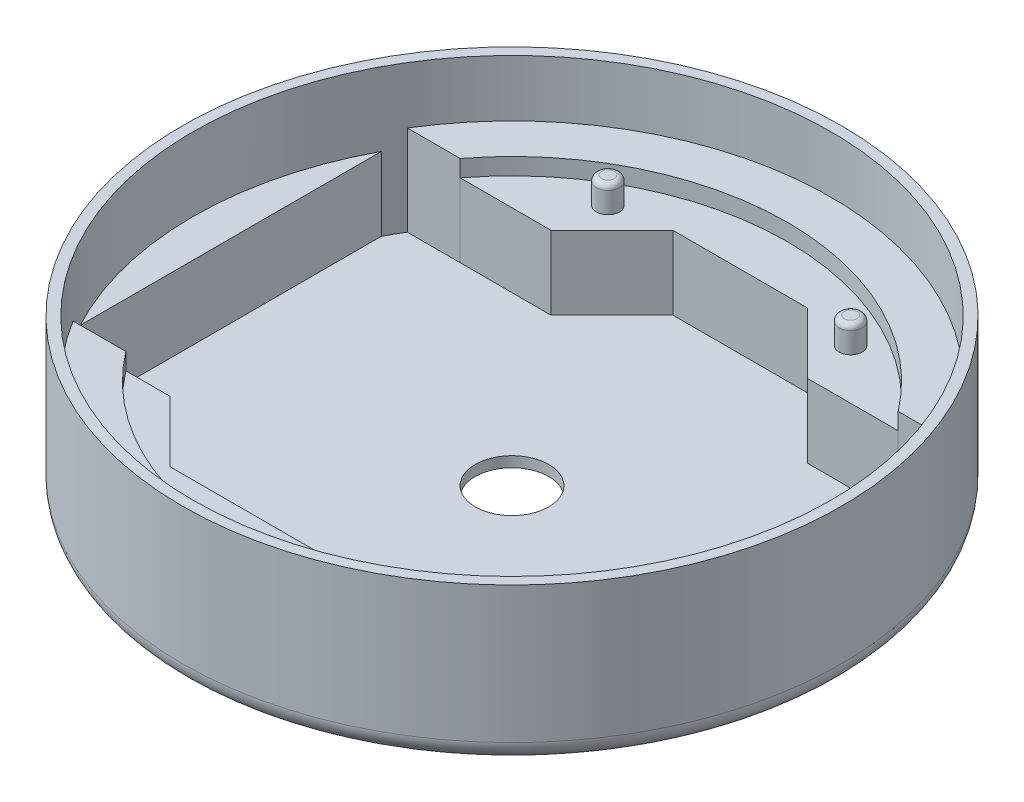
ISO-10303-21;
HEADER;
FILE_DESCRIPTION(('STEP AP214'),'2;1');
FILE_NAME('part.step','',(''),(''),'','','');
FILE_SCHEMA(('AUTOMOTIVE_DESIGN { 1 0 10303 214 1 1 1 1 }'));
ENDSEC;
DATA;
#1=APPLICATION_CONTEXT('core data for automotive mechanical design processes');
#2=APPLICATION_PROTOCOL_DEFINITION('international standard','automotive_design',2000,#1);
#3=PRODUCT_CONTEXT('',#1,'mechanical');
#4=PRODUCT('Part','Part','',(#3));
#5=PRODUCT_RELATED_PRODUCT_CATEGORY('part','',(#4));
#6=PRODUCT_DEFINITION_FORMATION('','',#4);
#7=PRODUCT_DEFINITION_CONTEXT('part definition',#1,'design');
#8=PRODUCT_DEFINITION('design','',#6,#7);
#9=PRODUCT_DEFINITION_SHAPE('','',#8);
#10=(LENGTH_UNIT() NAMED_UNIT(*) SI_UNIT(.MILLI.,.METRE.));
#11=(NAMED_UNIT(*) PLANE_ANGLE_UNIT() SI_UNIT($,.RADIAN.));
#12=(NAMED_UNIT(*) SI_UNIT($,.STERADIAN.) SOLID_ANGLE_UNIT());
#13=UNCERTAINTY_MEASURE_WITH_UNIT(LENGTH_MEASURE(1.E-05),#10,'distance_accuracy_value','');
#14=(GEOMETRIC_REPRESENTATION_CONTEXT(3) GLOBAL_UNCERTAINTY_ASSIGNED_CONTEXT((#13)) GLOBAL_UNIT_ASSIGNED_CONTEXT((#10,
#11,#12)) REPRESENTATION_CONTEXT('',''));
#15=CARTESIAN_POINT('',(0.,0.,0.));
#16=DIRECTION('',(0.,0.,1.));
#17=DIRECTION('',(1.,0.,0.));
#18=AXIS2_PLACEMENT_3D('',#15,#16,#17);
#19=CARTESIAN_POINT('',(25.8950646842212,8.,-15.925));
#20=DIRECTION('',(0.,0.,-1.));
#21=DIRECTION('',(-1.,0.,0.));
#22=AXIS2_PLACEMENT_3D('',#19,#20,#21);
#23=PLANE('',#22);
#24=DIRECTION('',(0.,-1.,0.));
#25=VECTOR('',#24,1.);
#26=CARTESIAN_POINT('',(20.8676034800358,8.,-15.925));
#27=LINE('',#26,#25);
#28=CARTESIAN_POINT('',(20.8676034800358,8.,-15.925));
#29=VERTEX_POINT('',#28);
#30=CARTESIAN_POINT('',(20.8676034800358,1.,-15.925));
#31=VERTEX_POINT('',#30);
#32=EDGE_CURVE('E11',#29,#31,#27,.T.);
#33=ORIENTED_EDGE('',*,*,#32,.F.);
#34=DIRECTION('',(1.,0.,0.));
#35=VECTOR('',#34,1.);
#36=CARTESIAN_POINT('',(25.8950646842212,8.,-15.925));
#37=LINE('',#36,#35);
#38=CARTESIAN_POINT('',(12.2172812531431,8.,-15.925));
#39=VERTEX_POINT('',#38);
#40=EDGE_CURVE('E299',#39,#29,#37,.T.);
#41=ORIENTED_EDGE('',*,*,#40,.F.);
#42=DIRECTION('',(0.,-1.,0.));
#43=VECTOR('',#42,1.);
#44=CARTESIAN_POINT('',(12.2172812531431,8.,-15.925));
#45=LINE('',#44,#43);
#46=CARTESIAN_POINT('',(12.2172812531431,1.,-15.925));
#47=VERTEX_POINT('',#46);
#48=EDGE_CURVE('E318',#39,#47,#45,.T.);
#49=ORIENTED_EDGE('',*,*,#48,.T.);
#50=DIRECTION('',(1.,0.,0.));
#51=VECTOR('',#50,1.);
#52=CARTESIAN_POINT('',(25.8950646842212,1.,-15.925));
#53=LINE('',#52,#51);
#54=EDGE_CURVE('E293',#47,#31,#53,.T.);
#55=ORIENTED_EDGE('',*,*,#54,.T.);
#56=EDGE_LOOP('',(#33,#41,#49,#55));
#57=FACE_BOUND('',#56,.T.);
#58=ADVANCED_FACE('F37',(#57),#23,.F.);
#59=CARTESIAN_POINT('',(-25.8950646842212,8.,-15.925));
#60=DIRECTION('',(0.,0.,-1.));
#61=DIRECTION('',(-1.,0.,0.));
#62=AXIS2_PLACEMENT_3D('',#59,#60,#61);
#63=PLANE('',#62);
#64=DIRECTION('',(0.,-1.,0.));
#65=VECTOR('',#64,1.);
#66=CARTESIAN_POINT('',(-20.8676034800358,8.,-15.925));
#67=LINE('',#66,#65);
#68=CARTESIAN_POINT('',(-20.8676034800358,8.,-15.925));
#69=VERTEX_POINT('',#68);
#70=CARTESIAN_POINT('',(-20.8676034800358,1.,-15.925));
#71=VERTEX_POINT('',#70);
#72=EDGE_CURVE('E46',#69,#71,#67,.T.);
#73=ORIENTED_EDGE('',*,*,#72,.F.);
#74=DIRECTION('',(0.,-1.,0.));
#75=VECTOR('',#74,1.);
#76=CARTESIAN_POINT('',(-20.8676034800358,9.6,-15.925));
#77=LINE('',#76,#75);
#78=CARTESIAN_POINT('',(-20.8676034800358,9.6,-15.925));
#79=VERTEX_POINT('',#78);
#80=EDGE_CURVE('E225',#79,#69,#77,.T.);
#81=ORIENTED_EDGE('',*,*,#80,.F.);
#82=DIRECTION('',(-1.,0.,0.));
#83=VECTOR('',#82,1.);
#84=CARTESIAN_POINT('',(-20.8676034800358,9.6,-15.925));
#85=LINE('',#84,#83);
#86=CARTESIAN_POINT('',(-25.8950646842212,9.6,-15.925));
#87=VERTEX_POINT('',#86);
#88=EDGE_CURVE('E221',#79,#87,#85,.T.);
#89=ORIENTED_EDGE('',*,*,#88,.T.);
#90=DIRECTION('',(0.,-1.,0.));
#91=VECTOR('',#90,1.);
#92=CARTESIAN_POINT('',(-25.8950646842212,8.,-15.925));
#93=LINE('',#92,#91);
#94=CARTESIAN_POINT('',(-25.8950646842212,1.,-15.925));
#95=VERTEX_POINT('',#94);
#96=EDGE_CURVE('E329',#87,#95,#93,.T.);
#97=ORIENTED_EDGE('',*,*,#96,.T.);
#98=DIRECTION('',(1.,0.,0.));
#99=VECTOR('',#98,1.);
#100=CARTESIAN_POINT('',(-25.8950646842212,1.,-15.925));
#101=LINE('',#100,#99);
#102=EDGE_CURVE('E303',#95,#71,#101,.T.);
#103=ORIENTED_EDGE('',*,*,#102,.T.);
#104=EDGE_LOOP('',(#73,#81,#89,#97,#103));
#105=FACE_BOUND('',#104,.T.);
#106=ADVANCED_FACE('F400',(#105),#63,.F.);
#107=CARTESIAN_POINT('',(0.,8.,0.));
#108=DIRECTION('',(0.,-1.,0.));
#109=DIRECTION('',(0.,0.,-1.));
#110=AXIS2_PLACEMENT_3D('',#107,#108,#109);
#111=PLANE('',#110);
#112=CARTESIAN_POINT('',(-11.56,8.,-20.7));
#113=DIRECTION('',(0.,-1.,0.));
#114=DIRECTION('',(0.,0.,-1.));
#115=AXIS2_PLACEMENT_3D('',#112,#113,#114);
#116=CIRCLE('',#115,1.1);
#117=CARTESIAN_POINT('',(-11.56,8.,-21.8));
#118=VERTEX_POINT('',#117);
#119=EDGE_CURVE('E355',#118,#118,#116,.F.);
#120=ORIENTED_EDGE('',*,*,#119,.F.);
#121=EDGE_LOOP('',(#120));
#122=FACE_BOUND('',#121,.T.);
#123=CARTESIAN_POINT('',(0.,8.,0.));
#124=DIRECTION('',(0.,-1.,0.));
#125=DIRECTION('',(0.,0.,-1.));
#126=AXIS2_PLACEMENT_3D('',#123,#124,#125);
#127=CIRCLE('',#126,26.25);
#128=EDGE_CURVE('E205',#69,#29,#127,.T.);
#129=ORIENTED_EDGE('',*,*,#128,.F.);
#130=DIRECTION('',(1.,0.,0.));
#131=VECTOR('',#130,1.);
#132=CARTESIAN_POINT('',(-25.8950646842212,8.,-15.925));
#133=LINE('',#132,#131);
#134=CARTESIAN_POINT('',(-12.2172812531431,8.,-15.925));
#135=VERTEX_POINT('',#134);
#136=EDGE_CURVE('E290',#69,#135,#133,.T.);
#137=ORIENTED_EDGE('',*,*,#136,.T.);
#138=DIRECTION('',(0.707106781186546,0.,-0.707106781186549));
#139=VECTOR('',#138,1.);
#140=CARTESIAN_POINT('',(-12.2172812531431,8.,-15.925));
#141=LINE('',#140,#139);
#142=CARTESIAN_POINT('',(-6.40928125314315,8.,-21.733));
#143=VERTEX_POINT('',#142);
#144=EDGE_CURVE('E292',#135,#143,#141,.T.);
#145=ORIENTED_EDGE('',*,*,#144,.T.);
#146=DIRECTION('',(1.,0.,0.));
#147=VECTOR('',#146,1.);
#148=CARTESIAN_POINT('',(-6.40928125314315,8.,-21.733));
#149=LINE('',#148,#147);
#150=CARTESIAN_POINT('',(6.40928125314315,8.,-21.733));
#151=VERTEX_POINT('',#150);
#152=EDGE_CURVE('E295',#143,#151,#149,.T.);
#153=ORIENTED_EDGE('',*,*,#152,.T.);
#154=DIRECTION('',(0.707106781186547,0.,0.707106781186548));
#155=VECTOR('',#154,1.);
#156=CARTESIAN_POINT('',(12.2172812531431,8.,-15.925));
#157=LINE('',#156,#155);
#158=EDGE_CURVE('E297',#151,#39,#157,.T.);
#159=ORIENTED_EDGE('',*,*,#158,.T.);
#160=ORIENTED_EDGE('',*,*,#40,.T.);
#161=EDGE_LOOP('',(#129,#137,#145,#153,#159,#160));
#162=FACE_BOUND('',#161,.T.);
#163=CARTESIAN_POINT('',(11.56,8.,-20.7));
#164=DIRECTION('',(0.,-1.,0.));
#165=DIRECTION('',(0.,0.,-1.));
#166=AXIS2_PLACEMENT_3D('',#163,#164,#165);
#167=CIRCLE('',#166,1.1);
#168=CARTESIAN_POINT('',(11.56,8.,-21.8));
#169=VERTEX_POINT('',#168);
#170=EDGE_CURVE('E358',#169,#169,#167,.F.);
#171=ORIENTED_EDGE('',*,*,#170,.F.);
#172=EDGE_LOOP('',(#171));
#173=FACE_BOUND('',#172,.T.);
#174=ADVANCED_FACE('F407',(#122,#162,#173),#111,.F.);
#175=CARTESIAN_POINT('',(0.,15.,0.));
#176=DIRECTION('',(0.,-1.,0.));
#177=DIRECTION('',(0.,0.,-1.));
#178=AXIS2_PLACEMENT_3D('',#175,#176,#177);
#179=CYLINDRICAL_SURFACE('',#178,30.4);
#180=CARTESIAN_POINT('',(0.,15.,0.));
#181=DIRECTION('',(0.,1.,0.));
#182=DIRECTION('',(0.,0.,1.));
#183=AXIS2_PLACEMENT_3D('',#180,#181,#182);
#184=CIRCLE('',#183,30.4);
#185=CARTESIAN_POINT('',(0.,15.,30.4));
#186=VERTEX_POINT('',#185);
#187=EDGE_CURVE('E341',#186,#186,#184,.T.);
#188=ORIENTED_EDGE('',*,*,#187,.T.);
#189=EDGE_LOOP('',(#188));
#190=FACE_BOUND('',#189,.T.);
#191=CARTESIAN_POINT('',(0.,9.6,0.));
#192=DIRECTION('',(0.,1.,0.));
#193=DIRECTION('',(0.,0.,1.));
#194=AXIS2_PLACEMENT_3D('',#191,#192,#193);
#195=CIRCLE('',#194,30.4);
#196=CARTESIAN_POINT('',(-25.8950646842212,9.6,15.925));
#197=VERTEX_POINT('',#196);
#198=CARTESIAN_POINT('',(25.8950646842212,9.6,15.925));
#199=VERTEX_POINT('',#198);
#200=EDGE_CURVE('E191',#197,#199,#195,.T.);
#201=ORIENTED_EDGE('',*,*,#200,.F.);
#202=DIRECTION('',(0.,-1.,0.));
#203=VECTOR('',#202,1.);
#204=CARTESIAN_POINT('',(-25.8950646842212,8.,15.925));
#205=LINE('',#204,#203);
#206=CARTESIAN_POINT('',(-25.8950646842212,1.,15.925));
#207=VERTEX_POINT('',#206);
#208=EDGE_CURVE('E187',#197,#207,#205,.T.);
#209=ORIENTED_EDGE('',*,*,#208,.T.);
#210=CARTESIAN_POINT('',(0.,1.,0.));
#211=DIRECTION('',(0.,1.,0.));
#212=DIRECTION('',(0.,0.,1.));
#213=AXIS2_PLACEMENT_3D('',#210,#211,#212);
#214=CIRCLE('',#213,30.4);
#215=CARTESIAN_POINT('',(-26.8,1.,14.3499128917217));
#216=VERTEX_POINT('',#215);
#217=EDGE_CURVE('E342',#216,#207,#214,.T.);
#218=ORIENTED_EDGE('',*,*,#217,.F.);
#219=DIRECTION('',(0.,-1.,0.));
#220=VECTOR('',#219,1.);
#221=CARTESIAN_POINT('',(-26.8,8.,14.3499128917217));
#222=LINE('',#221,#220);
#223=CARTESIAN_POINT('',(-26.8,8.,14.3499128917217));
#224=VERTEX_POINT('',#223);
#225=EDGE_CURVE('E239',#224,#216,#222,.T.);
#226=ORIENTED_EDGE('',*,*,#225,.F.);
#227=CARTESIAN_POINT('',(0.,8.,0.));
#228=DIRECTION('',(0.,1.,0.));
#229=DIRECTION('',(0.,0.,1.));
#230=AXIS2_PLACEMENT_3D('',#227,#228,#229);
#231=CIRCLE('',#230,30.4);
#232=CARTESIAN_POINT('',(-26.8,8.,-14.3499128917217));
#233=VERTEX_POINT('',#232);
#234=EDGE_CURVE('E230',#233,#224,#231,.T.);
#235=ORIENTED_EDGE('',*,*,#234,.F.);
#236=DIRECTION('',(0.,-1.,0.));
#237=VECTOR('',#236,1.);
#238=CARTESIAN_POINT('',(-26.8,8.,-14.3499128917217));
#239=LINE('',#238,#237);
#240=CARTESIAN_POINT('',(-26.8,1.,-14.3499128917217));
#241=VERTEX_POINT('',#240);
#242=EDGE_CURVE('E235',#233,#241,#239,.T.);
#243=ORIENTED_EDGE('',*,*,#242,.T.);
#244=EDGE_CURVE('E338',#95,#241,#214,.T.);
#245=ORIENTED_EDGE('',*,*,#244,.F.);
#246=ORIENTED_EDGE('',*,*,#96,.F.);
#247=CARTESIAN_POINT('',(0.,9.6,0.));
#248=DIRECTION('',(0.,-1.,0.));
#249=DIRECTION('',(0.,0.,-1.));
#250=AXIS2_PLACEMENT_3D('',#247,#248,#249);
#251=CIRCLE('',#250,30.4);
#252=CARTESIAN_POINT('',(25.8950646842212,9.6,-15.925));
#253=VERTEX_POINT('',#252);
#254=EDGE_CURVE('E209',#87,#253,#251,.T.);
#255=ORIENTED_EDGE('',*,*,#254,.T.);
#256=DIRECTION('',(0.,-1.,0.));
#257=VECTOR('',#256,1.);
#258=CARTESIAN_POINT('',(25.8950646842212,8.,-15.925));
#259=LINE('',#258,#257);
#260=CARTESIAN_POINT('',(25.8950646842212,1.,-15.925));
#261=VERTEX_POINT('',#260);
#262=EDGE_CURVE('E302',#253,#261,#259,.T.);
#263=ORIENTED_EDGE('',*,*,#262,.T.);
#264=CARTESIAN_POINT('',(26.8,1.,-14.3499128917216));
#265=VERTEX_POINT('',#264);
#266=EDGE_CURVE('E337',#265,#261,#214,.T.);
#267=ORIENTED_EDGE('',*,*,#266,.F.);
#268=DIRECTION('',(0.,-1.,0.));
#269=VECTOR('',#268,1.);
#270=CARTESIAN_POINT('',(26.8,8.,-14.3499128917217));
#271=LINE('',#270,#269);
#272=CARTESIAN_POINT('',(26.8,8.,-14.3499128917217));
#273=VERTEX_POINT('',#272);
#274=EDGE_CURVE('E251',#273,#265,#271,.T.);
#275=ORIENTED_EDGE('',*,*,#274,.F.);
#276=CARTESIAN_POINT('',(-2.46330733588707E-13,8.,0.));
#277=DIRECTION('',(0.,1.,0.));
#278=DIRECTION('',(0.,0.,1.));
#279=AXIS2_PLACEMENT_3D('',#276,#277,#278);
#280=CIRCLE('',#279,30.4000000000002);
#281=CARTESIAN_POINT('',(26.8,8.,14.3499128917217));
#282=VERTEX_POINT('',#281);
#283=EDGE_CURVE('E242',#282,#273,#280,.T.);
#284=ORIENTED_EDGE('',*,*,#283,.F.);
#285=DIRECTION('',(0.,-1.,0.));
#286=VECTOR('',#285,1.);
#287=CARTESIAN_POINT('',(26.8,8.,14.3499128917217));
#288=LINE('',#287,#286);
#289=CARTESIAN_POINT('',(26.8,1.,14.3499128917217));
#290=VERTEX_POINT('',#289);
#291=EDGE_CURVE('E247',#282,#290,#288,.T.);
#292=ORIENTED_EDGE('',*,*,#291,.T.);
#293=CARTESIAN_POINT('',(25.8950646842212,1.,15.925));
#294=VERTEX_POINT('',#293);
#295=EDGE_CURVE('E343',#294,#290,#214,.T.);
#296=ORIENTED_EDGE('',*,*,#295,.F.);
#297=DIRECTION('',(0.,-1.,0.));
#298=VECTOR('',#297,1.);
#299=CARTESIAN_POINT('',(25.8950646842212,8.,15.925));
#300=LINE('',#299,#298);
#301=EDGE_CURVE('E278',#199,#294,#300,.T.);
#302=ORIENTED_EDGE('',*,*,#301,.F.);
#303=EDGE_LOOP('',(#201,#209,#218,#226,#235,#243,#245,#246,#255,#263,#267,#275,#284,#292,#296,#302));
#304=FACE_BOUND('',#303,.T.);
#305=ADVANCED_FACE('F456',(#190,#304),#179,.F.);
#306=CARTESIAN_POINT('',(0.,8.,0.));
#307=DIRECTION('',(0.,-1.,0.));
#308=DIRECTION('',(0.,0.,-1.));
#309=AXIS2_PLACEMENT_3D('',#306,#307,#308);
#310=PLANE('',#309);
#311=CARTESIAN_POINT('',(0.,8.,0.));
#312=DIRECTION('',(0.,-1.,0.));
#313=DIRECTION('',(0.,0.,1.));
#314=AXIS2_PLACEMENT_3D('',#311,#312,#313);
#315=CIRCLE('',#314,26.25);
#316=CARTESIAN_POINT('',(20.8676034800357,8.,15.925));
#317=VERTEX_POINT('',#316);
#318=CARTESIAN_POINT('',(-20.8676034800357,8.,15.925));
#319=VERTEX_POINT('',#318);
#320=EDGE_CURVE('E201',#317,#319,#315,.T.);
#321=ORIENTED_EDGE('',*,*,#320,.F.);
#322=DIRECTION('',(-1.,0.,0.));
#323=VECTOR('',#322,1.);
#324=CARTESIAN_POINT('',(16.6540006918157,8.,15.925));
#325=LINE('',#324,#323);
#326=CARTESIAN_POINT('',(16.6540006918157,8.,15.925));
#327=VERTEX_POINT('',#326);
#328=EDGE_CURVE('E264',#317,#327,#325,.T.);
#329=ORIENTED_EDGE('',*,*,#328,.T.);
#330=DIRECTION('',(-0.707106781186554,0.,0.707106781186541));
#331=VECTOR('',#330,1.);
#332=CARTESIAN_POINT('',(10.8458,8.,21.7332006918156));
#333=LINE('',#332,#331);
#334=CARTESIAN_POINT('',(10.8458,8.,21.7332006918156));
#335=VERTEX_POINT('',#334);
#336=EDGE_CURVE('E254',#327,#335,#333,.T.);
#337=ORIENTED_EDGE('',*,*,#336,.T.);
#338=DIRECTION('',(-1.,0.,0.));
#339=VECTOR('',#338,1.);
#340=CARTESIAN_POINT('',(-10.8458,8.,21.7332006918156));
#341=LINE('',#340,#339);
#342=CARTESIAN_POINT('',(-10.8458,8.,21.7332006918156));
#343=VERTEX_POINT('',#342);
#344=EDGE_CURVE('E257',#335,#343,#341,.T.);
#345=ORIENTED_EDGE('',*,*,#344,.T.);
#346=DIRECTION('',(-0.707106781186548,0.,-0.707106781186548));
#347=VECTOR('',#346,1.);
#348=CARTESIAN_POINT('',(-10.8458,8.,21.7332006918156));
#349=LINE('',#348,#347);
#350=CARTESIAN_POINT('',(-16.6540006918156,8.,15.925));
#351=VERTEX_POINT('',#350);
#352=EDGE_CURVE('E260',#343,#351,#349,.T.);
#353=ORIENTED_EDGE('',*,*,#352,.T.);
#354=DIRECTION('',(-1.,0.,0.));
#355=VECTOR('',#354,1.);
#356=CARTESIAN_POINT('',(-16.6540006918156,8.,15.925));
#357=LINE('',#356,#355);
#358=EDGE_CURVE('E262',#351,#319,#357,.T.);
#359=ORIENTED_EDGE('',*,*,#358,.T.);
#360=EDGE_LOOP('',(#321,#329,#337,#345,#353,#359));
#361=FACE_BOUND('',#360,.T.);
#362=ADVANCED_FACE('F492',(#361),#310,.F.);
#363=CARTESIAN_POINT('',(0.,1.,0.));
#364=DIRECTION('',(0.,1.,0.));
#365=DIRECTION('',(0.,0.,1.));
#366=AXIS2_PLACEMENT_3D('',#363,#364,#365);
#367=PLANE('',#366);
#368=CARTESIAN_POINT('',(0.,1.,0.));
#369=DIRECTION('',(0.,1.,0.));
#370=DIRECTION('',(0.,0.,1.));
#371=AXIS2_PLACEMENT_3D('',#368,#369,#370);
#372=CIRCLE('',#371,3.5);
#373=CARTESIAN_POINT('',(0.,1.,3.5));
#374=VERTEX_POINT('',#373);
#375=EDGE_CURVE('E331',#374,#374,#372,.T.);
#376=ORIENTED_EDGE('',*,*,#375,.F.);
#377=EDGE_LOOP('',(#376));
#378=FACE_BOUND('',#377,.T.);
#379=ORIENTED_EDGE('',*,*,#244,.T.);
#380=DIRECTION('',(0.,0.,-1.));
#381=VECTOR('',#380,1.);
#382=CARTESIAN_POINT('',(-26.8,1.,-14.3499128917217));
#383=LINE('',#382,#381);
#384=EDGE_CURVE('E228',#216,#241,#383,.T.);
#385=ORIENTED_EDGE('',*,*,#384,.F.);
#386=ORIENTED_EDGE('',*,*,#217,.T.);
#387=DIRECTION('',(-1.,0.,0.));
#388=VECTOR('',#387,1.);
#389=CARTESIAN_POINT('',(-16.6540006918156,1.,15.925));
#390=LINE('',#389,#388);
#391=CARTESIAN_POINT('',(-16.6540006918156,1.,15.925));
#392=VERTEX_POINT('',#391);
#393=EDGE_CURVE('E273',#392,#207,#390,.T.);
#394=ORIENTED_EDGE('',*,*,#393,.F.);
#395=DIRECTION('',(-0.707106781186548,0.,-0.707106781186548));
#396=VECTOR('',#395,1.);
#397=CARTESIAN_POINT('',(-10.8458,1.,21.7332006918156));
#398=LINE('',#397,#396);
#399=CARTESIAN_POINT('',(-10.8458,1.,21.7332006918156));
#400=VERTEX_POINT('',#399);
#401=EDGE_CURVE('E271',#400,#392,#398,.T.);
#402=ORIENTED_EDGE('',*,*,#401,.F.);
#403=DIRECTION('',(-1.,0.,0.));
#404=VECTOR('',#403,1.);
#405=CARTESIAN_POINT('',(-10.8458,1.,21.7332006918156));
#406=LINE('',#405,#404);
#407=CARTESIAN_POINT('',(10.8458,1.,21.7332006918156));
#408=VERTEX_POINT('',#407);
#409=EDGE_CURVE('E269',#408,#400,#406,.T.);
#410=ORIENTED_EDGE('',*,*,#409,.F.);
#411=DIRECTION('',(-0.707106781186554,0.,0.707106781186541));
#412=VECTOR('',#411,1.);
#413=CARTESIAN_POINT('',(10.8458,1.,21.7332006918156));
#414=LINE('',#413,#412);
#415=CARTESIAN_POINT('',(16.6540006918157,1.,15.925));
#416=VERTEX_POINT('',#415);
#417=EDGE_CURVE('E253',#416,#408,#414,.T.);
#418=ORIENTED_EDGE('',*,*,#417,.F.);
#419=DIRECTION('',(-1.,0.,0.));
#420=VECTOR('',#419,1.);
#421=CARTESIAN_POINT('',(16.6540006918157,1.,15.925));
#422=LINE('',#421,#420);
#423=EDGE_CURVE('E258',#294,#416,#422,.T.);
#424=ORIENTED_EDGE('',*,*,#423,.F.);
#425=ORIENTED_EDGE('',*,*,#295,.T.);
#426=DIRECTION('',(0.,0.,1.));
#427=VECTOR('',#426,1.);
#428=CARTESIAN_POINT('',(26.8,1.,-14.3499128917217));
#429=LINE('',#428,#427);
#430=EDGE_CURVE('E241',#265,#290,#429,.T.);
#431=ORIENTED_EDGE('',*,*,#430,.F.);
#432=ORIENTED_EDGE('',*,*,#266,.T.);
#433=EDGE_CURVE('E313',#31,#261,#53,.T.);
#434=ORIENTED_EDGE('',*,*,#433,.F.);
#435=ORIENTED_EDGE('',*,*,#54,.F.);
#436=DIRECTION('',(0.707106781186547,0.,0.707106781186548));
#437=VECTOR('',#436,1.);
#438=CARTESIAN_POINT('',(12.2172812531431,1.,-15.925));
#439=LINE('',#438,#437);
#440=CARTESIAN_POINT('',(6.40928125314315,1.,-21.733));
#441=VERTEX_POINT('',#440);
#442=EDGE_CURVE('E310',#441,#47,#439,.T.);
#443=ORIENTED_EDGE('',*,*,#442,.F.);
#444=DIRECTION('',(1.,0.,0.));
#445=VECTOR('',#444,1.);
#446=CARTESIAN_POINT('',(-6.40928125314315,1.,-21.733));
#447=LINE('',#446,#445);
#448=CARTESIAN_POINT('',(-6.40928125314315,1.,-21.733));
#449=VERTEX_POINT('',#448);
#450=EDGE_CURVE('E308',#449,#441,#447,.T.);
#451=ORIENTED_EDGE('',*,*,#450,.F.);
#452=DIRECTION('',(0.707106781186546,0.,-0.707106781186549));
#453=VECTOR('',#452,1.);
#454=CARTESIAN_POINT('',(-12.2172812531431,1.,-15.925));
#455=LINE('',#454,#453);
#456=CARTESIAN_POINT('',(-12.2172812531431,1.,-15.925));
#457=VERTEX_POINT('',#456);
#458=EDGE_CURVE('E306',#457,#449,#455,.T.);
#459=ORIENTED_EDGE('',*,*,#458,.F.);
#460=EDGE_CURVE('E289',#71,#457,#101,.T.);
#461=ORIENTED_EDGE('',*,*,#460,.F.);
#462=ORIENTED_EDGE('',*,*,#102,.F.);
#463=EDGE_LOOP('',(#379,#385,#386,#394,#402,#410,#418,#424,#425,#431,#432,#434,#435,#443,#451,
#459,#461,#462));
#464=FACE_BOUND('',#463,.T.);
#465=ADVANCED_FACE('F450',(#378,#464),#367,.T.);
#466=CARTESIAN_POINT('',(0.,15.,0.));
#467=DIRECTION('',(0.,-1.,0.));
#468=DIRECTION('',(0.,0.,-1.));
#469=AXIS2_PLACEMENT_3D('',#466,#467,#468);
#470=CYLINDRICAL_SURFACE('',#469,31.4);
#471=CARTESIAN_POINT('',(0.,2.,0.));
#472=DIRECTION('',(0.,1.,0.));
#473=DIRECTION('',(0.,0.,1.));
#474=AXIS2_PLACEMENT_3D('',#471,#472,#473);
#475=CIRCLE('',#474,31.4);
#476=CARTESIAN_POINT('',(0.,2.,31.4));
#477=VERTEX_POINT('',#476);
#478=EDGE_CURVE('E349',#477,#477,#475,.T.);
#479=ORIENTED_EDGE('',*,*,#478,.T.);
#480=EDGE_LOOP('',(#479));
#481=FACE_BOUND('',#480,.T.);
#482=CARTESIAN_POINT('',(0.,15.,0.));
#483=DIRECTION('',(0.,1.,0.));
#484=DIRECTION('',(0.,0.,1.));
#485=AXIS2_PLACEMENT_3D('',#482,#483,#484);
#486=CIRCLE('',#485,31.4);
#487=CARTESIAN_POINT('',(0.,15.,31.4));
#488=VERTEX_POINT('',#487);
#489=EDGE_CURVE('E346',#488,#488,#486,.T.);
#490=ORIENTED_EDGE('',*,*,#489,.F.);
#491=EDGE_LOOP('',(#490));
#492=FACE_BOUND('',#491,.T.);
#493=ADVANCED_FACE('F522',(#481,#492),#470,.T.);
#494=CARTESIAN_POINT('',(0.,15.,0.));
#495=DIRECTION('',(0.,1.,0.));
#496=DIRECTION('',(0.,0.,1.));
#497=AXIS2_PLACEMENT_3D('',#494,#495,#496);
#498=PLANE('',#497);
#499=ORIENTED_EDGE('',*,*,#187,.F.);
#500=EDGE_LOOP('',(#499));
#501=FACE_BOUND('',#500,.T.);
#502=ORIENTED_EDGE('',*,*,#489,.T.);
#503=EDGE_LOOP('',(#502));
#504=FACE_BOUND('',#503,.T.);
#505=ADVANCED_FACE('F524',(#501,#504),#498,.T.);
#506=CARTESIAN_POINT('',(0.,0.,0.));
#507=DIRECTION('',(0.,1.,0.));
#508=DIRECTION('',(0.,0.,1.));
#509=AXIS2_PLACEMENT_3D('',#506,#507,#508);
#510=PLANE('',#509);
#511=CARTESIAN_POINT('',(0.,0.,0.));
#512=DIRECTION('',(0.,1.,0.));
#513=DIRECTION('',(0.,0.,1.));
#514=AXIS2_PLACEMENT_3D('',#511,#512,#513);
#515=CIRCLE('',#514,3.5);
#516=CARTESIAN_POINT('',(0.,0.,3.5));
#517=VERTEX_POINT('',#516);
#518=EDGE_CURVE('E334',#517,#517,#515,.F.);
#519=ORIENTED_EDGE('',*,*,#518,.F.);
#520=EDGE_LOOP('',(#519));
#521=FACE_BOUND('',#520,.T.);
#522=CARTESIAN_POINT('',(0.,0.,0.));
#523=DIRECTION('',(0.,1.,0.));
#524=DIRECTION('',(0.,0.,1.));
#525=AXIS2_PLACEMENT_3D('',#522,#523,#524);
#526=CIRCLE('',#525,29.4);
#527=CARTESIAN_POINT('',(0.,0.,29.4));
#528=VERTEX_POINT('',#527);
#529=EDGE_CURVE('E352',#528,#528,#526,.F.);
#530=ORIENTED_EDGE('',*,*,#529,.T.);
#531=EDGE_LOOP('',(#530));
#532=FACE_BOUND('',#531,.T.);
#533=ADVANCED_FACE('F527',(#521,#532),#510,.F.);
#534=CARTESIAN_POINT('',(0.,2.,0.));
#535=DIRECTION('',(0.,1.,0.));
#536=DIRECTION('',(0.,0.,1.));
#537=AXIS2_PLACEMENT_3D('',#534,#535,#536);
#538=TOROIDAL_SURFACE('',#537,29.4,2.);
#539=ORIENTED_EDGE('',*,*,#529,.F.);
#540=EDGE_LOOP('',(#539));
#541=FACE_BOUND('',#540,.T.);
#542=ORIENTED_EDGE('',*,*,#478,.F.);
#543=EDGE_LOOP('',(#542));
#544=FACE_BOUND('',#543,.T.);
#545=ADVANCED_FACE('F531',(#541,#544),#538,.T.);
#546=CARTESIAN_POINT('',(0.,-0.000999999999999916,0.));
#547=DIRECTION('',(0.,1.,0.));
#548=DIRECTION('',(0.,0.,1.));
#549=AXIS2_PLACEMENT_3D('',#546,#547,#548);
#550=CYLINDRICAL_SURFACE('',#549,3.5);
#551=ORIENTED_EDGE('',*,*,#375,.T.);
#552=EDGE_LOOP('',(#551));
#553=FACE_BOUND('',#552,.T.);
#554=ORIENTED_EDGE('',*,*,#518,.T.);
#555=EDGE_LOOP('',(#554));
#556=FACE_BOUND('',#555,.T.);
#557=ADVANCED_FACE('F519',(#553,#556),#550,.F.);
#558=ORIENTED_EDGE('',*,*,#136,.F.);
#559=ORIENTED_EDGE('',*,*,#72,.T.);
#560=ORIENTED_EDGE('',*,*,#460,.T.);
#561=DIRECTION('',(0.,-1.,0.));
#562=VECTOR('',#561,1.);
#563=CARTESIAN_POINT('',(-12.2172812531431,8.,-15.925));
#564=LINE('',#563,#562);
#565=EDGE_CURVE('E326',#135,#457,#564,.T.);
#566=ORIENTED_EDGE('',*,*,#565,.F.);
#567=EDGE_LOOP('',(#558,#559,#560,#566));
#568=FACE_BOUND('',#567,.T.);
#569=ADVANCED_FACE('F410',(#568),#63,.F.);
#570=CARTESIAN_POINT('',(-12.2172812531431,8.,-15.925));
#571=DIRECTION('',(-0.707106781186549,0.,-0.707106781186546));
#572=DIRECTION('',(-0.707106781186546,0.,0.707106781186549));
#573=AXIS2_PLACEMENT_3D('',#570,#571,#572);
#574=PLANE('',#573);
#575=ORIENTED_EDGE('',*,*,#458,.T.);
#576=DIRECTION('',(0.,-1.,0.));
#577=VECTOR('',#576,1.);
#578=CARTESIAN_POINT('',(-6.40928125314315,8.,-21.733));
#579=LINE('',#578,#577);
#580=EDGE_CURVE('E323',#143,#449,#579,.T.);
#581=ORIENTED_EDGE('',*,*,#580,.F.);
#582=ORIENTED_EDGE('',*,*,#144,.F.);
#583=ORIENTED_EDGE('',*,*,#565,.T.);
#584=EDGE_LOOP('',(#575,#581,#582,#583));
#585=FACE_BOUND('',#584,.T.);
#586=ADVANCED_FACE('F440',(#585),#574,.F.);
#587=CARTESIAN_POINT('',(-6.40928125314315,8.,-21.733));
#588=DIRECTION('',(0.,0.,-1.));
#589=DIRECTION('',(-1.,0.,0.));
#590=AXIS2_PLACEMENT_3D('',#587,#588,#589);
#591=PLANE('',#590);
#592=ORIENTED_EDGE('',*,*,#450,.T.);
#593=DIRECTION('',(0.,-1.,0.));
#594=VECTOR('',#593,1.);
#595=CARTESIAN_POINT('',(6.40928125314315,8.,-21.733));
#596=LINE('',#595,#594);
#597=EDGE_CURVE('E320',#151,#441,#596,.T.);
#598=ORIENTED_EDGE('',*,*,#597,.F.);
#599=ORIENTED_EDGE('',*,*,#152,.F.);
#600=ORIENTED_EDGE('',*,*,#580,.T.);
#601=EDGE_LOOP('',(#592,#598,#599,#600));
#602=FACE_BOUND('',#601,.T.);
#603=ADVANCED_FACE('F423',(#602),#591,.F.);
#604=CARTESIAN_POINT('',(12.2172812531431,8.,-15.925));
#605=DIRECTION('',(0.707106781186548,0.,-0.707106781186547));
#606=DIRECTION('',(-0.707106781186547,0.,-0.707106781186548));
#607=AXIS2_PLACEMENT_3D('',#604,#605,#606);
#608=PLANE('',#607);
#609=ORIENTED_EDGE('',*,*,#442,.T.);
#610=ORIENTED_EDGE('',*,*,#48,.F.);
#611=ORIENTED_EDGE('',*,*,#158,.F.);
#612=ORIENTED_EDGE('',*,*,#597,.T.);
#613=EDGE_LOOP('',(#609,#610,#611,#612));
#614=FACE_BOUND('',#613,.T.);
#615=ADVANCED_FACE('F415',(#614),#608,.F.);
#616=DIRECTION('',(0.,-1.,0.));
#617=VECTOR('',#616,1.);
#618=CARTESIAN_POINT('',(20.8676034800358,9.6,-15.925));
#619=LINE('',#618,#617);
#620=CARTESIAN_POINT('',(20.8676034800358,9.6,-15.925));
#621=VERTEX_POINT('',#620);
#622=EDGE_CURVE('E223',#621,#29,#619,.T.);
#623=ORIENTED_EDGE('',*,*,#622,.T.);
#624=ORIENTED_EDGE('',*,*,#32,.T.);
#625=ORIENTED_EDGE('',*,*,#433,.T.);
#626=ORIENTED_EDGE('',*,*,#262,.F.);
#627=DIRECTION('',(1.,0.,0.));
#628=VECTOR('',#627,1.);
#629=CARTESIAN_POINT('',(20.8676034800358,9.6,-15.925));
#630=LINE('',#629,#628);
#631=EDGE_CURVE('E216',#621,#253,#630,.T.);
#632=ORIENTED_EDGE('',*,*,#631,.F.);
#633=EDGE_LOOP('',(#623,#624,#625,#626,#632));
#634=FACE_BOUND('',#633,.T.);
#635=ADVANCED_FACE('F403',(#634),#23,.F.);
#636=CARTESIAN_POINT('',(10.8458,8.,21.7332006918156));
#637=DIRECTION('',(0.707106781186541,0.,0.707106781186554));
#638=DIRECTION('',(0.707106781186554,0.,-0.707106781186541));
#639=AXIS2_PLACEMENT_3D('',#636,#637,#638);
#640=PLANE('',#639);
#641=ORIENTED_EDGE('',*,*,#417,.T.);
#642=DIRECTION('',(0.,-1.,0.));
#643=VECTOR('',#642,1.);
#644=CARTESIAN_POINT('',(10.8458,8.,21.7332006918156));
#645=LINE('',#644,#643);
#646=EDGE_CURVE('E287',#335,#408,#645,.T.);
#647=ORIENTED_EDGE('',*,*,#646,.F.);
#648=ORIENTED_EDGE('',*,*,#336,.F.);
#649=DIRECTION('',(0.,-1.,0.));
#650=VECTOR('',#649,1.);
#651=CARTESIAN_POINT('',(16.6540006918157,8.,15.925));
#652=LINE('',#651,#650);
#653=EDGE_CURVE('E266',#327,#416,#652,.T.);
#654=ORIENTED_EDGE('',*,*,#653,.T.);
#655=EDGE_LOOP('',(#641,#647,#648,#654));
#656=FACE_BOUND('',#655,.T.);
#657=ADVANCED_FACE('F414',(#656),#640,.F.);
#658=CARTESIAN_POINT('',(-10.8458,8.,21.7332006918156));
#659=DIRECTION('',(0.,0.,1.));
#660=DIRECTION('',(1.,0.,0.));
#661=AXIS2_PLACEMENT_3D('',#658,#659,#660);
#662=PLANE('',#661);
#663=ORIENTED_EDGE('',*,*,#409,.T.);
#664=DIRECTION('',(0.,-1.,0.));
#665=VECTOR('',#664,1.);
#666=CARTESIAN_POINT('',(-10.8458,8.,21.7332006918156));
#667=LINE('',#666,#665);
#668=EDGE_CURVE('E284',#343,#400,#667,.T.);
#669=ORIENTED_EDGE('',*,*,#668,.F.);
#670=ORIENTED_EDGE('',*,*,#344,.F.);
#671=ORIENTED_EDGE('',*,*,#646,.T.);
#672=EDGE_LOOP('',(#663,#669,#670,#671));
#673=FACE_BOUND('',#672,.T.);
#674=ADVANCED_FACE('F420',(#673),#662,.F.);
#675=CARTESIAN_POINT('',(-10.8458,8.,21.7332006918156));
#676=DIRECTION('',(-0.707106781186547,0.,0.707106781186548));
#677=DIRECTION('',(0.707106781186548,0.,0.707106781186547));
#678=AXIS2_PLACEMENT_3D('',#675,#676,#677);
#679=PLANE('',#678);
#680=ORIENTED_EDGE('',*,*,#401,.T.);
#681=DIRECTION('',(0.,-1.,0.));
#682=VECTOR('',#681,1.);
#683=CARTESIAN_POINT('',(-16.6540006918156,8.,15.925));
#684=LINE('',#683,#682);
#685=EDGE_CURVE('E281',#351,#392,#684,.T.);
#686=ORIENTED_EDGE('',*,*,#685,.F.);
#687=ORIENTED_EDGE('',*,*,#352,.F.);
#688=ORIENTED_EDGE('',*,*,#668,.T.);
#689=EDGE_LOOP('',(#680,#686,#687,#688));
#690=FACE_BOUND('',#689,.T.);
#691=ADVANCED_FACE('F501',(#690),#679,.F.);
#692=CARTESIAN_POINT('',(-16.6540006918156,8.,15.925));
#693=DIRECTION('',(0.,0.,1.));
#694=DIRECTION('',(1.,0.,0.));
#695=AXIS2_PLACEMENT_3D('',#692,#693,#694);
#696=PLANE('',#695);
#697=ORIENTED_EDGE('',*,*,#393,.T.);
#698=ORIENTED_EDGE('',*,*,#208,.F.);
#699=DIRECTION('',(-1.,0.,0.));
#700=VECTOR('',#699,1.);
#701=CARTESIAN_POINT('',(-20.8676034800357,9.6,15.925));
#702=LINE('',#701,#700);
#703=CARTESIAN_POINT('',(-20.8676034800357,9.6,15.925));
#704=VERTEX_POINT('',#703);
#705=EDGE_CURVE('E178',#704,#197,#702,.T.);
#706=ORIENTED_EDGE('',*,*,#705,.F.);
#707=DIRECTION('',(0.,-1.,0.));
#708=VECTOR('',#707,1.);
#709=CARTESIAN_POINT('',(-20.8676034800357,9.6,15.925));
#710=LINE('',#709,#708);
#711=EDGE_CURVE('E184',#704,#319,#710,.T.);
#712=ORIENTED_EDGE('',*,*,#711,.T.);
#713=ORIENTED_EDGE('',*,*,#358,.F.);
#714=ORIENTED_EDGE('',*,*,#685,.T.);
#715=EDGE_LOOP('',(#697,#698,#706,#712,#713,#714));
#716=FACE_BOUND('',#715,.T.);
#717=ADVANCED_FACE('F181',(#716),#696,.F.);
#718=CARTESIAN_POINT('',(16.6540006918157,8.,15.925));
#719=DIRECTION('',(0.,0.,1.));
#720=DIRECTION('',(1.,0.,0.));
#721=AXIS2_PLACEMENT_3D('',#718,#719,#720);
#722=PLANE('',#721);
#723=ORIENTED_EDGE('',*,*,#423,.T.);
#724=ORIENTED_EDGE('',*,*,#653,.F.);
#725=ORIENTED_EDGE('',*,*,#328,.F.);
#726=DIRECTION('',(0.,-1.,0.));
#727=VECTOR('',#726,1.);
#728=CARTESIAN_POINT('',(20.8676034800357,9.6,15.925));
#729=LINE('',#728,#727);
#730=CARTESIAN_POINT('',(20.8676034800357,9.6,15.925));
#731=VERTEX_POINT('',#730);
#732=EDGE_CURVE('E206',#731,#317,#729,.T.);
#733=ORIENTED_EDGE('',*,*,#732,.F.);
#734=DIRECTION('',(-1.,0.,0.));
#735=VECTOR('',#734,1.);
#736=CARTESIAN_POINT('',(20.8676034800357,9.6,15.925));
#737=LINE('',#736,#735);
#738=EDGE_CURVE('E197',#199,#731,#737,.T.);
#739=ORIENTED_EDGE('',*,*,#738,.F.);
#740=ORIENTED_EDGE('',*,*,#301,.T.);
#741=EDGE_LOOP('',(#723,#724,#725,#733,#739,#740));
#742=FACE_BOUND('',#741,.T.);
#743=ADVANCED_FACE('F488',(#742),#722,.F.);
#744=CARTESIAN_POINT('',(26.8,8.,-14.3499128917217));
#745=DIRECTION('',(1.,0.,0.));
#746=DIRECTION('',(0.,0.,-1.));
#747=AXIS2_PLACEMENT_3D('',#744,#745,#746);
#748=PLANE('',#747);
#749=ORIENTED_EDGE('',*,*,#430,.T.);
#750=ORIENTED_EDGE('',*,*,#291,.F.);
#751=DIRECTION('',(0.,0.,1.));
#752=VECTOR('',#751,1.);
#753=CARTESIAN_POINT('',(26.8,8.,-14.3499128917217));
#754=LINE('',#753,#752);
#755=EDGE_CURVE('E245',#273,#282,#754,.T.);
#756=ORIENTED_EDGE('',*,*,#755,.F.);
#757=ORIENTED_EDGE('',*,*,#274,.T.);
#758=EDGE_LOOP('',(#749,#750,#756,#757));
#759=FACE_BOUND('',#758,.T.);
#760=ADVANCED_FACE('F477',(#759),#748,.F.);
#761=CARTESIAN_POINT('',(-2.46330733588707E-13,8.,0.));
#762=DIRECTION('',(0.,1.,0.));
#763=DIRECTION('',(0.,0.,1.));
#764=AXIS2_PLACEMENT_3D('',#761,#762,#763);
#765=PLANE('',#764);
#766=ORIENTED_EDGE('',*,*,#283,.T.);
#767=ORIENTED_EDGE('',*,*,#755,.T.);
#768=EDGE_LOOP('',(#766,#767));
#769=FACE_BOUND('',#768,.T.);
#770=ADVANCED_FACE('F479',(#769),#765,.T.);
#771=CARTESIAN_POINT('',(-26.8,8.,-14.3499128917217));
#772=DIRECTION('',(-1.,0.,0.));
#773=DIRECTION('',(0.,0.,1.));
#774=AXIS2_PLACEMENT_3D('',#771,#772,#773);
#775=PLANE('',#774);
#776=ORIENTED_EDGE('',*,*,#384,.T.);
#777=ORIENTED_EDGE('',*,*,#242,.F.);
#778=DIRECTION('',(0.,0.,-1.));
#779=VECTOR('',#778,1.);
#780=CARTESIAN_POINT('',(-26.8,8.,-14.3499128917217));
#781=LINE('',#780,#779);
#782=EDGE_CURVE('E233',#224,#233,#781,.T.);
#783=ORIENTED_EDGE('',*,*,#782,.F.);
#784=ORIENTED_EDGE('',*,*,#225,.T.);
#785=EDGE_LOOP('',(#776,#777,#783,#784));
#786=FACE_BOUND('',#785,.T.);
#787=ADVANCED_FACE('F466',(#786),#775,.F.);
#788=CARTESIAN_POINT('',(0.,8.,0.));
#789=DIRECTION('',(0.,1.,0.));
#790=DIRECTION('',(0.,0.,1.));
#791=AXIS2_PLACEMENT_3D('',#788,#789,#790);
#792=PLANE('',#791);
#793=ORIENTED_EDGE('',*,*,#234,.T.);
#794=ORIENTED_EDGE('',*,*,#782,.T.);
#795=EDGE_LOOP('',(#793,#794));
#796=FACE_BOUND('',#795,.T.);
#797=ADVANCED_FACE('F486',(#796),#792,.T.);
#798=CARTESIAN_POINT('',(0.,9.6,0.));
#799=DIRECTION('',(0.,-1.,0.));
#800=DIRECTION('',(0.,0.,-1.));
#801=AXIS2_PLACEMENT_3D('',#798,#799,#800);
#802=CYLINDRICAL_SURFACE('',#801,26.25);
#803=ORIENTED_EDGE('',*,*,#128,.T.);
#804=ORIENTED_EDGE('',*,*,#622,.F.);
#805=CARTESIAN_POINT('',(0.,9.6,0.));
#806=DIRECTION('',(0.,-1.,0.));
#807=DIRECTION('',(0.,0.,-1.));
#808=AXIS2_PLACEMENT_3D('',#805,#806,#807);
#809=CIRCLE('',#808,26.25);
#810=EDGE_CURVE('E219',#79,#621,#809,.T.);
#811=ORIENTED_EDGE('',*,*,#810,.F.);
#812=ORIENTED_EDGE('',*,*,#80,.T.);
#813=EDGE_LOOP('',(#803,#804,#811,#812));
#814=FACE_BOUND('',#813,.T.);
#815=ADVANCED_FACE('F429',(#814),#802,.F.);
#816=CARTESIAN_POINT('',(0.,9.6,0.));
#817=DIRECTION('',(0.,-1.,0.));
#818=DIRECTION('',(0.,0.,-1.));
#819=AXIS2_PLACEMENT_3D('',#816,#817,#818);
#820=PLANE('',#819);
#821=ORIENTED_EDGE('',*,*,#254,.F.);
#822=ORIENTED_EDGE('',*,*,#88,.F.);
#823=ORIENTED_EDGE('',*,*,#810,.T.);
#824=ORIENTED_EDGE('',*,*,#631,.T.);
#825=EDGE_LOOP('',(#821,#822,#823,#824));
#826=FACE_BOUND('',#825,.T.);
#827=ADVANCED_FACE('F459',(#826),#820,.F.);
#828=CARTESIAN_POINT('',(0.,9.6,0.));
#829=DIRECTION('',(0.,-1.,0.));
#830=DIRECTION('',(0.,0.,-1.));
#831=AXIS2_PLACEMENT_3D('',#828,#829,#830);
#832=CYLINDRICAL_SURFACE('',#831,26.25);
#833=ORIENTED_EDGE('',*,*,#320,.T.);
#834=ORIENTED_EDGE('',*,*,#711,.F.);
#835=CARTESIAN_POINT('',(0.,9.6,0.));
#836=DIRECTION('',(0.,-1.,0.));
#837=DIRECTION('',(0.,0.,1.));
#838=AXIS2_PLACEMENT_3D('',#835,#836,#837);
#839=CIRCLE('',#838,26.25);
#840=EDGE_CURVE('E192',#731,#704,#839,.T.);
#841=ORIENTED_EDGE('',*,*,#840,.F.);
#842=ORIENTED_EDGE('',*,*,#732,.T.);
#843=EDGE_LOOP('',(#833,#834,#841,#842));
#844=FACE_BOUND('',#843,.T.);
#845=ADVANCED_FACE('F203',(#844),#832,.F.);
#846=CARTESIAN_POINT('',(0.,9.6,0.));
#847=DIRECTION('',(0.,1.,0.));
#848=DIRECTION('',(0.,0.,1.));
#849=AXIS2_PLACEMENT_3D('',#846,#847,#848);
#850=PLANE('',#849);
#851=ORIENTED_EDGE('',*,*,#840,.T.);
#852=ORIENTED_EDGE('',*,*,#705,.T.);
#853=ORIENTED_EDGE('',*,*,#200,.T.);
#854=ORIENTED_EDGE('',*,*,#738,.T.);
#855=EDGE_LOOP('',(#851,#852,#853,#854));
#856=FACE_BOUND('',#855,.T.);
#857=ADVANCED_FACE('F195',(#856),#850,.T.);
#858=CARTESIAN_POINT('',(-11.56,10.5,-20.7));
#859=DIRECTION('',(0.,-1.,0.));
#860=DIRECTION('',(0.,0.,-1.));
#861=AXIS2_PLACEMENT_3D('',#858,#859,#860);
#862=CYLINDRICAL_SURFACE('',#861,1.1);
#863=CARTESIAN_POINT('',(-11.56,10.,-20.7));
#864=DIRECTION('',(0.,1.,0.));
#865=DIRECTION('',(0.,0.,1.));
#866=AXIS2_PLACEMENT_3D('',#863,#864,#865);
#867=CIRCLE('',#866,1.1);
#868=CARTESIAN_POINT('',(-11.56,10.,-19.6));
#869=VERTEX_POINT('',#868);
#870=EDGE_CURVE('E370',#869,#869,#867,.F.);
#871=ORIENTED_EDGE('',*,*,#870,.T.);
#872=EDGE_LOOP('',(#871));
#873=FACE_BOUND('',#872,.T.);
#874=ORIENTED_EDGE('',*,*,#119,.T.);
#875=EDGE_LOOP('',(#874));
#876=FACE_BOUND('',#875,.T.);
#877=ADVANCED_FACE('F379',(#873,#876),#862,.T.);
#878=CARTESIAN_POINT('',(-11.56,10.5,-20.7));
#879=DIRECTION('',(0.,1.,0.));
#880=DIRECTION('',(0.,0.,1.));
#881=AXIS2_PLACEMENT_3D('',#878,#879,#880);
#882=PLANE('',#881);
#883=CARTESIAN_POINT('',(-11.56,10.5,-20.7));
#884=DIRECTION('',(0.,1.,0.));
#885=DIRECTION('',(0.,0.,1.));
#886=AXIS2_PLACEMENT_3D('',#883,#884,#885);
#887=CIRCLE('',#886,0.600000000000001);
#888=CARTESIAN_POINT('',(-11.56,10.5,-20.1));
#889=VERTEX_POINT('',#888);
#890=EDGE_CURVE('E367',#889,#889,#887,.T.);
#891=ORIENTED_EDGE('',*,*,#890,.T.);
#892=EDGE_LOOP('',(#891));
#893=FACE_BOUND('',#892,.T.);
#894=ADVANCED_FACE('F387',(#893),#882,.T.);
#895=CARTESIAN_POINT('',(11.56,10.5,-20.7));
#896=DIRECTION('',(0.,-1.,0.));
#897=DIRECTION('',(0.,0.,-1.));
#898=AXIS2_PLACEMENT_3D('',#895,#896,#897);
#899=CYLINDRICAL_SURFACE('',#898,1.1);
#900=CARTESIAN_POINT('',(11.56,10.,-20.7));
#901=DIRECTION('',(0.,-1.,0.));
#902=DIRECTION('',(0.,0.,-1.));
#903=AXIS2_PLACEMENT_3D('',#900,#901,#902);
#904=CIRCLE('',#903,1.1);
#905=CARTESIAN_POINT('',(11.56,10.,-21.8));
#906=VERTEX_POINT('',#905);
#907=EDGE_CURVE('E364',#906,#906,#904,.T.);
#908=ORIENTED_EDGE('',*,*,#907,.T.);
#909=EDGE_LOOP('',(#908));
#910=FACE_BOUND('',#909,.T.);
#911=ORIENTED_EDGE('',*,*,#170,.T.);
#912=EDGE_LOOP('',(#911));
#913=FACE_BOUND('',#912,.T.);
#914=ADVANCED_FACE('F389',(#910,#913),#899,.T.);
#915=CARTESIAN_POINT('',(11.56,10.5,-20.7));
#916=DIRECTION('',(0.,-1.,0.));
#917=DIRECTION('',(0.,0.,-1.));
#918=AXIS2_PLACEMENT_3D('',#915,#916,#917);
#919=PLANE('',#918);
#920=CARTESIAN_POINT('',(11.56,10.5,-20.7));
#921=DIRECTION('',(0.,-1.,0.));
#922=DIRECTION('',(0.,0.,-1.));
#923=AXIS2_PLACEMENT_3D('',#920,#921,#922);
#924=CIRCLE('',#923,0.600000000000001);
#925=CARTESIAN_POINT('',(11.56,10.5,-21.3));
#926=VERTEX_POINT('',#925);
#927=EDGE_CURVE('E361',#926,#926,#924,.F.);
#928=ORIENTED_EDGE('',*,*,#927,.T.);
#929=EDGE_LOOP('',(#928));
#930=FACE_BOUND('',#929,.T.);
#931=ADVANCED_FACE('F395',(#930),#919,.F.);
#932=CARTESIAN_POINT('',(11.56,10.,-20.7));
#933=DIRECTION('',(0.,-1.,0.));
#934=DIRECTION('',(0.,0.,-1.));
#935=AXIS2_PLACEMENT_3D('',#932,#933,#934);
#936=TOROIDAL_SURFACE('',#935,0.600000000000001,0.5);
#937=ORIENTED_EDGE('',*,*,#907,.F.);
#938=EDGE_LOOP('',(#937));
#939=FACE_BOUND('',#938,.T.);
#940=ORIENTED_EDGE('',*,*,#927,.F.);
#941=EDGE_LOOP('',(#940));
#942=FACE_BOUND('',#941,.T.);
#943=ADVANCED_FACE('F384',(#939,#942),#936,.T.);
#944=CARTESIAN_POINT('',(-11.56,10.,-20.7));
#945=DIRECTION('',(0.,1.,0.));
#946=DIRECTION('',(0.,0.,1.));
#947=AXIS2_PLACEMENT_3D('',#944,#945,#946);
#948=TOROIDAL_SURFACE('',#947,0.600000000000001,0.5);
#949=ORIENTED_EDGE('',*,*,#870,.F.);
#950=EDGE_LOOP('',(#949));
#951=FACE_BOUND('',#950,.T.);
#952=ORIENTED_EDGE('',*,*,#890,.F.);
#953=EDGE_LOOP('',(#952));
#954=FACE_BOUND('',#953,.T.);
#955=ADVANCED_FACE('F39',(#951,#954),#948,.T.);
#956=CLOSED_SHELL('',(#58,#106,#174,#305,#362,#465,#493,#505,#533,#545,#557,#569,#586,#603,#615,
#635,#657,#674,#691,#717,#743,#760,#770,#787,#797,#815,#827,#845,#857,#877,#894,#914,#931,#943,#955));
#957=MANIFOLD_SOLID_BREP('B2',#956);
#958=ADVANCED_BREP_SHAPE_REPRESENTATION('',(#18,#957),#14);
#959=SHAPE_DEFINITION_REPRESENTATION(#9,#958);
ENDSEC;
END-ISO-10303-21;
